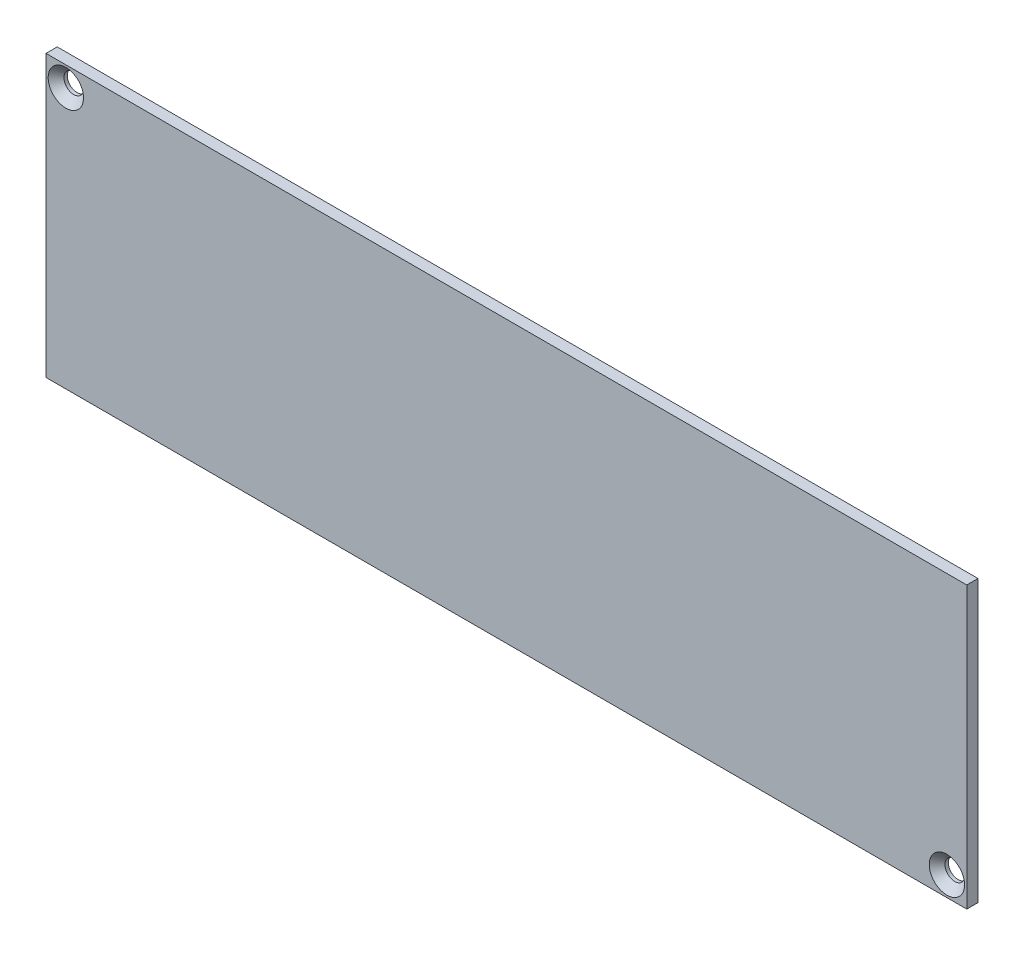
ISO-10303-21;
HEADER;
FILE_DESCRIPTION(('STEP AP214'),'2;1');
FILE_NAME('part.step','',(''),(''),'','','');
FILE_SCHEMA(('AUTOMOTIVE_DESIGN { 1 0 10303 214 1 1 1 1 }'));
ENDSEC;
DATA;
#1=APPLICATION_CONTEXT('core data for automotive mechanical design processes');
#2=APPLICATION_PROTOCOL_DEFINITION('international standard','automotive_design',2000,#1);
#3=PRODUCT_CONTEXT('',#1,'mechanical');
#4=PRODUCT('Part','Part','',(#3));
#5=PRODUCT_RELATED_PRODUCT_CATEGORY('part','',(#4));
#6=PRODUCT_DEFINITION_FORMATION('','',#4);
#7=PRODUCT_DEFINITION_CONTEXT('part definition',#1,'design');
#8=PRODUCT_DEFINITION('design','',#6,#7);
#9=PRODUCT_DEFINITION_SHAPE('','',#8);
#10=(LENGTH_UNIT() NAMED_UNIT(*) SI_UNIT(.MILLI.,.METRE.));
#11=(NAMED_UNIT(*) PLANE_ANGLE_UNIT() SI_UNIT($,.RADIAN.));
#12=(NAMED_UNIT(*) SI_UNIT($,.STERADIAN.) SOLID_ANGLE_UNIT());
#13=UNCERTAINTY_MEASURE_WITH_UNIT(LENGTH_MEASURE(1.E-05),#10,'distance_accuracy_value','');
#14=(GEOMETRIC_REPRESENTATION_CONTEXT(3) GLOBAL_UNCERTAINTY_ASSIGNED_CONTEXT((#13)) GLOBAL_UNIT_ASSIGNED_CONTEXT((#10,
#11,#12)) REPRESENTATION_CONTEXT('',''));
#15=CARTESIAN_POINT('',(0.,0.,0.));
#16=DIRECTION('',(0.,0.,1.));
#17=DIRECTION('',(1.,0.,0.));
#18=AXIS2_PLACEMENT_3D('',#15,#16,#17);
#19=CARTESIAN_POINT('',(0.,0.,2.));
#20=DIRECTION('',(0.,0.,1.));
#21=DIRECTION('',(1.,0.,0.));
#22=AXIS2_PLACEMENT_3D('',#19,#20,#21);
#23=PLANE('',#22);
#24=CARTESIAN_POINT('',(-78.4644660940672,21.4644660940673,2.));
#25=DIRECTION('',(0.,0.,1.));
#26=DIRECTION('',(1.,0.,0.));
#27=AXIS2_PLACEMENT_3D('',#24,#25,#26);
#28=CIRCLE('',#27,3.15);
#29=CARTESIAN_POINT('',(-75.3144660940673,21.4644660940673,2.));
#30=VERTEX_POINT('',#29);
#31=EDGE_CURVE('E212',#30,#30,#28,.T.);
#32=ORIENTED_EDGE('',*,*,#31,.F.);
#33=EDGE_LOOP('',(#32));
#34=FACE_BOUND('',#33,.T.);
#35=CARTESIAN_POINT('',(78.4644660940673,-21.4644660940673,2.));
#36=DIRECTION('',(0.,0.,1.));
#37=DIRECTION('',(1.,0.,0.));
#38=AXIS2_PLACEMENT_3D('',#35,#36,#37);
#39=CIRCLE('',#38,3.15);
#40=CARTESIAN_POINT('',(81.6144660940673,-21.4644660940673,2.));
#41=VERTEX_POINT('',#40);
#42=EDGE_CURVE('E216',#41,#41,#39,.T.);
#43=ORIENTED_EDGE('',*,*,#42,.F.);
#44=EDGE_LOOP('',(#43));
#45=FACE_BOUND('',#44,.T.);
#46=DIRECTION('',(0.,1.,0.));
#47=VECTOR('',#46,1.);
#48=CARTESIAN_POINT('',(82.,14.,2.));
#49=LINE('',#48,#47);
#50=CARTESIAN_POINT('',(82.,-25.,2.));
#51=VERTEX_POINT('',#50);
#52=CARTESIAN_POINT('',(82.,25.,2.));
#53=VERTEX_POINT('',#52);
#54=EDGE_CURVE('E104',#51,#53,#49,.T.);
#55=ORIENTED_EDGE('',*,*,#54,.T.);
#56=DIRECTION('',(-1.,0.,0.));
#57=VECTOR('',#56,1.);
#58=CARTESIAN_POINT('',(82.,25.,2.));
#59=LINE('',#58,#57);
#60=CARTESIAN_POINT('',(-82.,25.,2.));
#61=VERTEX_POINT('',#60);
#62=EDGE_CURVE('E136',#53,#61,#59,.T.);
#63=ORIENTED_EDGE('',*,*,#62,.T.);
#64=DIRECTION('',(0.,-1.,0.));
#65=VECTOR('',#64,1.);
#66=CARTESIAN_POINT('',(-82.,25.,2.));
#67=LINE('',#66,#65);
#68=CARTESIAN_POINT('',(-82.,-25.,2.));
#69=VERTEX_POINT('',#68);
#70=EDGE_CURVE('E139',#61,#69,#67,.T.);
#71=ORIENTED_EDGE('',*,*,#70,.T.);
#72=DIRECTION('',(1.,0.,0.));
#73=VECTOR('',#72,1.);
#74=CARTESIAN_POINT('',(-82.,-25.,2.));
#75=LINE('',#74,#73);
#76=EDGE_CURVE('E149',#69,#51,#75,.T.);
#77=ORIENTED_EDGE('',*,*,#76,.T.);
#78=EDGE_LOOP('',(#55,#63,#71,#77));
#79=FACE_BOUND('',#78,.T.);
#80=ADVANCED_FACE('F85',(#34,#45,#79),#23,.T.);
#81=CARTESIAN_POINT('',(0.,0.,0.));
#82=DIRECTION('',(0.,0.,1.));
#83=DIRECTION('',(1.,0.,0.));
#84=AXIS2_PLACEMENT_3D('',#81,#82,#83);
#85=PLANE('',#84);
#86=DIRECTION('',(-1.,0.,0.));
#87=VECTOR('',#86,1.);
#88=CARTESIAN_POINT('',(82.,25.,0.));
#89=LINE('',#88,#87);
#90=CARTESIAN_POINT('',(82.,25.,0.));
#91=VERTEX_POINT('',#90);
#92=CARTESIAN_POINT('',(-82.,25.,0.));
#93=VERTEX_POINT('',#92);
#94=EDGE_CURVE('E142',#91,#93,#89,.T.);
#95=ORIENTED_EDGE('',*,*,#94,.F.);
#96=DIRECTION('',(0.,-1.,0.));
#97=VECTOR('',#96,1.);
#98=CARTESIAN_POINT('',(82.,14.,0.));
#99=LINE('',#98,#97);
#100=CARTESIAN_POINT('',(82.,-25.,0.));
#101=VERTEX_POINT('',#100);
#102=EDGE_CURVE('E129',#91,#101,#99,.T.);
#103=ORIENTED_EDGE('',*,*,#102,.T.);
#104=DIRECTION('',(1.,0.,0.));
#105=VECTOR('',#104,1.);
#106=CARTESIAN_POINT('',(-82.,-25.,0.));
#107=LINE('',#106,#105);
#108=CARTESIAN_POINT('',(-82.,-25.,0.));
#109=VERTEX_POINT('',#108);
#110=EDGE_CURVE('E161',#109,#101,#107,.T.);
#111=ORIENTED_EDGE('',*,*,#110,.F.);
#112=DIRECTION('',(0.,-1.,0.));
#113=VECTOR('',#112,1.);
#114=CARTESIAN_POINT('',(-82.,25.,0.));
#115=LINE('',#114,#113);
#116=EDGE_CURVE('E122',#93,#109,#115,.T.);
#117=ORIENTED_EDGE('',*,*,#116,.F.);
#118=EDGE_LOOP('',(#95,#103,#111,#117));
#119=FACE_BOUND('',#118,.T.);
#120=CARTESIAN_POINT('',(-78.4644660940672,21.4644660940673,0.));
#121=DIRECTION('',(0.,0.,1.));
#122=DIRECTION('',(1.,0.,0.));
#123=AXIS2_PLACEMENT_3D('',#120,#121,#122);
#124=CIRCLE('',#123,1.75);
#125=CARTESIAN_POINT('',(-76.7144660940672,21.4644660940673,0.));
#126=VERTEX_POINT('',#125);
#127=EDGE_CURVE('E158',#126,#126,#124,.T.);
#128=ORIENTED_EDGE('',*,*,#127,.T.);
#129=EDGE_LOOP('',(#128));
#130=FACE_BOUND('',#129,.T.);
#131=CARTESIAN_POINT('',(78.4644660940673,-21.4644660940673,0.));
#132=DIRECTION('',(0.,0.,1.));
#133=DIRECTION('',(1.,0.,0.));
#134=AXIS2_PLACEMENT_3D('',#131,#132,#133);
#135=CIRCLE('',#134,1.75);
#136=CARTESIAN_POINT('',(80.2144660940673,-21.4644660940673,0.));
#137=VERTEX_POINT('',#136);
#138=EDGE_CURVE('E225',#137,#137,#135,.T.);
#139=ORIENTED_EDGE('',*,*,#138,.T.);
#140=EDGE_LOOP('',(#139));
#141=FACE_BOUND('',#140,.T.);
#142=ADVANCED_FACE('F172',(#119,#130,#141),#85,.F.);
#143=CARTESIAN_POINT('',(82.,25.,2.));
#144=DIRECTION('',(0.,-1.,0.));
#145=DIRECTION('',(1.,0.,0.));
#146=AXIS2_PLACEMENT_3D('',#143,#144,#145);
#147=PLANE('',#146);
#148=ORIENTED_EDGE('',*,*,#94,.T.);
#149=DIRECTION('',(0.,0.,-1.));
#150=VECTOR('',#149,1.);
#151=CARTESIAN_POINT('',(-82.,25.,2.));
#152=LINE('',#151,#150);
#153=EDGE_CURVE('E96',#61,#93,#152,.T.);
#154=ORIENTED_EDGE('',*,*,#153,.F.);
#155=ORIENTED_EDGE('',*,*,#62,.F.);
#156=DIRECTION('',(0.,0.,-1.));
#157=VECTOR('',#156,1.);
#158=CARTESIAN_POINT('',(82.,25.,2.));
#159=LINE('',#158,#157);
#160=EDGE_CURVE('E12',#53,#91,#159,.T.);
#161=ORIENTED_EDGE('',*,*,#160,.T.);
#162=EDGE_LOOP('',(#148,#154,#155,#161));
#163=FACE_BOUND('',#162,.T.);
#164=ADVANCED_FACE('F87',(#163),#147,.F.);
#165=CARTESIAN_POINT('',(-82.,25.,2.));
#166=DIRECTION('',(1.,0.,0.));
#167=DIRECTION('',(0.,0.,-1.));
#168=AXIS2_PLACEMENT_3D('',#165,#166,#167);
#169=PLANE('',#168);
#170=ORIENTED_EDGE('',*,*,#116,.T.);
#171=DIRECTION('',(0.,0.,-1.));
#172=VECTOR('',#171,1.);
#173=CARTESIAN_POINT('',(-82.,-25.,2.));
#174=LINE('',#173,#172);
#175=EDGE_CURVE('E144',#69,#109,#174,.T.);
#176=ORIENTED_EDGE('',*,*,#175,.F.);
#177=ORIENTED_EDGE('',*,*,#70,.F.);
#178=ORIENTED_EDGE('',*,*,#153,.T.);
#179=EDGE_LOOP('',(#170,#176,#177,#178));
#180=FACE_BOUND('',#179,.T.);
#181=ADVANCED_FACE('F146',(#180),#169,.F.);
#182=CARTESIAN_POINT('',(-82.,-25.,2.));
#183=DIRECTION('',(0.,1.,0.));
#184=DIRECTION('',(0.,0.,1.));
#185=AXIS2_PLACEMENT_3D('',#182,#183,#184);
#186=PLANE('',#185);
#187=ORIENTED_EDGE('',*,*,#110,.T.);
#188=DIRECTION('',(0.,0.,-1.));
#189=VECTOR('',#188,1.);
#190=CARTESIAN_POINT('',(82.,-25.,2.));
#191=LINE('',#190,#189);
#192=EDGE_CURVE('E152',#51,#101,#191,.T.);
#193=ORIENTED_EDGE('',*,*,#192,.F.);
#194=ORIENTED_EDGE('',*,*,#76,.F.);
#195=ORIENTED_EDGE('',*,*,#175,.T.);
#196=EDGE_LOOP('',(#187,#193,#194,#195));
#197=FACE_BOUND('',#196,.T.);
#198=ADVANCED_FACE('F170',(#197),#186,.F.);
#199=CARTESIAN_POINT('',(82.,14.,2.));
#200=DIRECTION('',(1.,0.,0.));
#201=DIRECTION('',(0.,0.,-1.));
#202=AXIS2_PLACEMENT_3D('',#199,#200,#201);
#203=PLANE('',#202);
#204=ORIENTED_EDGE('',*,*,#102,.F.);
#205=ORIENTED_EDGE('',*,*,#160,.F.);
#206=ORIENTED_EDGE('',*,*,#54,.F.);
#207=ORIENTED_EDGE('',*,*,#192,.T.);
#208=EDGE_LOOP('',(#204,#205,#206,#207));
#209=FACE_BOUND('',#208,.T.);
#210=ADVANCED_FACE('F174',(#209),#203,.T.);
#211=CARTESIAN_POINT('',(-78.4644660940672,21.4644660940673,2.));
#212=DIRECTION('',(0.,0.,-1.));
#213=DIRECTION('',(-1.,0.,0.));
#214=AXIS2_PLACEMENT_3D('',#211,#212,#213);
#215=CYLINDRICAL_SURFACE('',#214,1.75);
#216=CARTESIAN_POINT('',(-78.4644660940672,21.4644660940673,0.600000000000004));
#217=DIRECTION('',(0.,0.,1.));
#218=DIRECTION('',(1.,0.,0.));
#219=AXIS2_PLACEMENT_3D('',#216,#217,#218);
#220=CIRCLE('',#219,1.75);
#221=CARTESIAN_POINT('',(-76.7144660940672,21.4644660940673,0.600000000000004));
#222=VERTEX_POINT('',#221);
#223=EDGE_CURVE('E89',#222,#222,#220,.F.);
#224=ORIENTED_EDGE('',*,*,#223,.F.);
#225=EDGE_LOOP('',(#224));
#226=FACE_BOUND('',#225,.T.);
#227=ORIENTED_EDGE('',*,*,#127,.F.);
#228=EDGE_LOOP('',(#227));
#229=FACE_BOUND('',#228,.T.);
#230=ADVANCED_FACE('F176',(#226,#229),#215,.F.);
#231=CARTESIAN_POINT('',(78.4644660940673,-21.4644660940673,2.));
#232=DIRECTION('',(0.,0.,-1.));
#233=DIRECTION('',(-1.,0.,0.));
#234=AXIS2_PLACEMENT_3D('',#231,#232,#233);
#235=CYLINDRICAL_SURFACE('',#234,1.75);
#236=CARTESIAN_POINT('',(78.4644660940673,-21.4644660940673,0.600000000000004));
#237=DIRECTION('',(0.,0.,1.));
#238=DIRECTION('',(1.,0.,0.));
#239=AXIS2_PLACEMENT_3D('',#236,#237,#238);
#240=CIRCLE('',#239,1.75);
#241=CARTESIAN_POINT('',(80.2144660940673,-21.4644660940673,0.600000000000004));
#242=VERTEX_POINT('',#241);
#243=EDGE_CURVE('E221',#242,#242,#240,.F.);
#244=ORIENTED_EDGE('',*,*,#243,.F.);
#245=EDGE_LOOP('',(#244));
#246=FACE_BOUND('',#245,.T.);
#247=ORIENTED_EDGE('',*,*,#138,.F.);
#248=EDGE_LOOP('',(#247));
#249=FACE_BOUND('',#248,.T.);
#250=ADVANCED_FACE('F182',(#246,#249),#235,.F.);
#251=CARTESIAN_POINT('',(78.4644660940673,-21.4644660940673,2.));
#252=DIRECTION('',(0.,0.,1.));
#253=DIRECTION('',(1.,0.,0.));
#254=AXIS2_PLACEMENT_3D('',#251,#252,#253);
#255=CONICAL_SURFACE('',#254,3.15,0.785398163397451);
#256=ORIENTED_EDGE('',*,*,#243,.T.);
#257=EDGE_LOOP('',(#256));
#258=FACE_BOUND('',#257,.T.);
#259=ORIENTED_EDGE('',*,*,#42,.T.);
#260=EDGE_LOOP('',(#259));
#261=FACE_BOUND('',#260,.T.);
#262=ADVANCED_FACE('F198',(#258,#261),#255,.F.);
#263=CARTESIAN_POINT('',(-78.4644660940672,21.4644660940673,2.));
#264=DIRECTION('',(0.,0.,1.));
#265=DIRECTION('',(1.,0.,0.));
#266=AXIS2_PLACEMENT_3D('',#263,#264,#265);
#267=CONICAL_SURFACE('',#266,3.15,0.785398163397451);
#268=ORIENTED_EDGE('',*,*,#223,.T.);
#269=EDGE_LOOP('',(#268));
#270=FACE_BOUND('',#269,.T.);
#271=ORIENTED_EDGE('',*,*,#31,.T.);
#272=EDGE_LOOP('',(#271));
#273=FACE_BOUND('',#272,.T.);
#274=ADVANCED_FACE('F202',(#270,#273),#267,.F.);
#275=CLOSED_SHELL('',(#80,#142,#164,#181,#198,#210,#230,#250,#262,#274));
#276=MANIFOLD_SOLID_BREP('B2',#275);
#277=ADVANCED_BREP_SHAPE_REPRESENTATION('',(#18,#276),#14);
#278=SHAPE_DEFINITION_REPRESENTATION(#9,#277);
ENDSEC;
END-ISO-10303-21;
